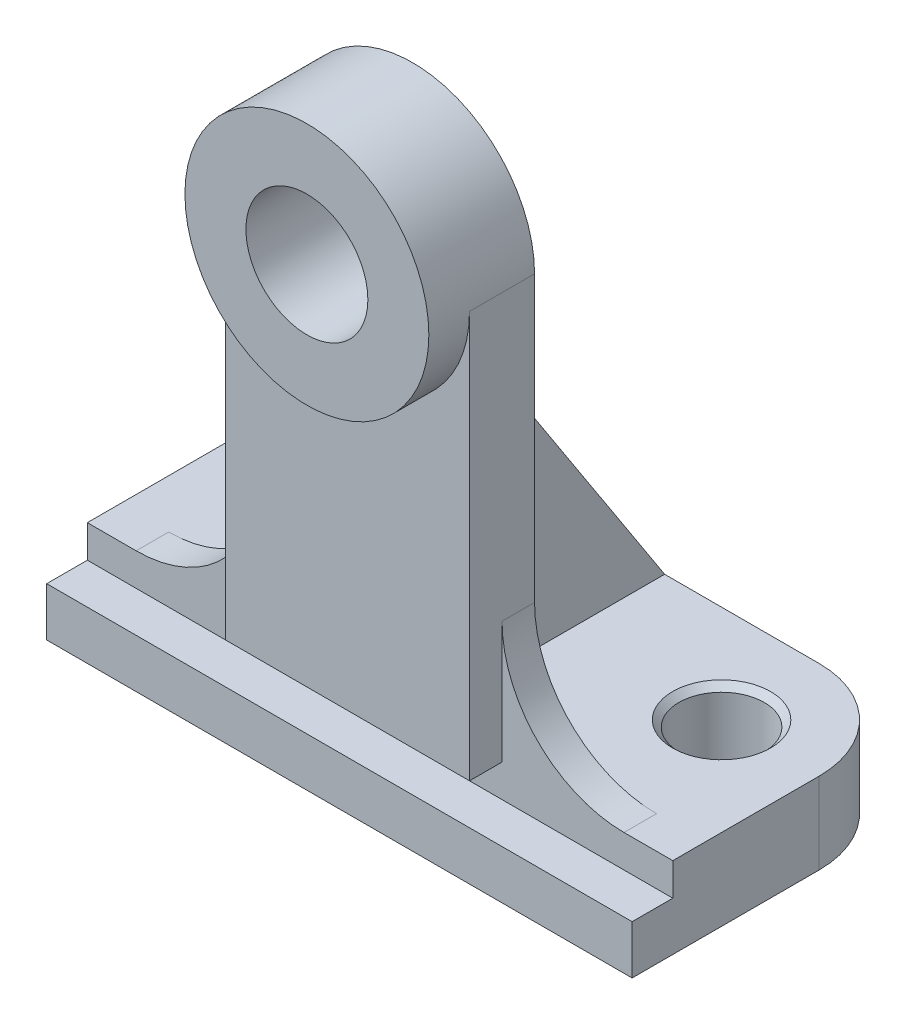
ISO-10303-21;
HEADER;
FILE_DESCRIPTION(('STEP AP214'),'2;1');
FILE_NAME('part.step','',(''),(''),'','','');
FILE_SCHEMA(('AUTOMOTIVE_DESIGN { 1 0 10303 214 1 1 1 1 }'));
ENDSEC;
DATA;
#1=APPLICATION_CONTEXT('core data for automotive mechanical design processes');
#2=APPLICATION_PROTOCOL_DEFINITION('international standard','automotive_design',2000,#1);
#3=PRODUCT_CONTEXT('',#1,'mechanical');
#4=PRODUCT('Part','Part','',(#3));
#5=PRODUCT_RELATED_PRODUCT_CATEGORY('part','',(#4));
#6=PRODUCT_DEFINITION_FORMATION('','',#4);
#7=PRODUCT_DEFINITION_CONTEXT('part definition',#1,'design');
#8=PRODUCT_DEFINITION('design','',#6,#7);
#9=PRODUCT_DEFINITION_SHAPE('','',#8);
#10=(LENGTH_UNIT() NAMED_UNIT(*) SI_UNIT(.MILLI.,.METRE.));
#11=(NAMED_UNIT(*) PLANE_ANGLE_UNIT() SI_UNIT($,.RADIAN.));
#12=(NAMED_UNIT(*) SI_UNIT($,.STERADIAN.) SOLID_ANGLE_UNIT());
#13=UNCERTAINTY_MEASURE_WITH_UNIT(LENGTH_MEASURE(1.E-05),#10,'distance_accuracy_value','');
#14=(GEOMETRIC_REPRESENTATION_CONTEXT(3) GLOBAL_UNCERTAINTY_ASSIGNED_CONTEXT((#13)) GLOBAL_UNIT_ASSIGNED_CONTEXT((#10,
#11,#12)) REPRESENTATION_CONTEXT('',''));
#15=CARTESIAN_POINT('',(0.,0.,0.));
#16=DIRECTION('',(0.,0.,1.));
#17=DIRECTION('',(1.,0.,0.));
#18=AXIS2_PLACEMENT_3D('',#15,#16,#17);
#19=CARTESIAN_POINT('',(36.,5.,0.));
#20=DIRECTION('',(0.,1.,0.));
#21=DIRECTION('',(0.,0.,1.));
#22=AXIS2_PLACEMENT_3D('',#19,#20,#21);
#23=PLANE('',#22);
#24=CARTESIAN_POINT('',(-24.,5.,-5.50000000000006));
#25=DIRECTION('',(0.,1.,0.));
#26=DIRECTION('',(0.,0.,1.));
#27=AXIS2_PLACEMENT_3D('',#24,#25,#26);
#28=CIRCLE('',#27,6.025);
#29=CARTESIAN_POINT('',(-24.,5.,0.524999999999947));
#30=VERTEX_POINT('',#29);
#31=EDGE_CURVE('E598',#30,#30,#28,.T.);
#32=ORIENTED_EDGE('',*,*,#31,.F.);
#33=EDGE_LOOP('',(#32));
#34=FACE_BOUND('',#33,.T.);
#35=DIRECTION('',(-1.,0.,0.));
#36=VECTOR('',#35,1.);
#37=CARTESIAN_POINT('',(36.,5.,-17.5000000000001));
#38=LINE('',#37,#36);
#39=CARTESIAN_POINT('',(-4.99999999999999,5.,-17.5000000000001));
#40=VERTEX_POINT('',#39);
#41=CARTESIAN_POINT('',(-24.,5.,-17.5000000000001));
#42=VERTEX_POINT('',#41);
#43=EDGE_CURVE('E288',#40,#42,#38,.T.);
#44=ORIENTED_EDGE('',*,*,#43,.T.);
#45=CARTESIAN_POINT('',(-24.,5.,-5.50000000000006));
#46=DIRECTION('',(0.,1.,0.));
#47=DIRECTION('',(0.,0.,1.));
#48=AXIS2_PLACEMENT_3D('',#45,#46,#47);
#49=CIRCLE('',#48,12.);
#50=CARTESIAN_POINT('',(-36.,5.,-5.50000000000005));
#51=VERTEX_POINT('',#50);
#52=EDGE_CURVE('E347',#42,#51,#49,.T.);
#53=ORIENTED_EDGE('',*,*,#52,.T.);
#54=DIRECTION('',(0.,0.,-1.));
#55=VECTOR('',#54,1.);
#56=CARTESIAN_POINT('',(-36.,5.,0.));
#57=LINE('',#56,#55);
#58=CARTESIAN_POINT('',(-36.,5.,12.5));
#59=VERTEX_POINT('',#58);
#60=EDGE_CURVE('E273',#59,#51,#57,.T.);
#61=ORIENTED_EDGE('',*,*,#60,.F.);
#62=DIRECTION('',(-1.,0.,0.));
#63=VECTOR('',#62,1.);
#64=CARTESIAN_POINT('',(36.,5.,12.5));
#65=LINE('',#64,#63);
#66=CARTESIAN_POINT('',(-30.,5.,12.5));
#67=VERTEX_POINT('',#66);
#68=EDGE_CURVE('E313',#67,#59,#65,.T.);
#69=ORIENTED_EDGE('',*,*,#68,.F.);
#70=DIRECTION('',(0.,0.,-1.));
#71=VECTOR('',#70,1.);
#72=CARTESIAN_POINT('',(-30.,5.,0.));
#73=LINE('',#72,#71);
#74=CARTESIAN_POINT('',(-30.,5.,8.50000000000001));
#75=VERTEX_POINT('',#74);
#76=EDGE_CURVE('E318',#67,#75,#73,.T.);
#77=ORIENTED_EDGE('',*,*,#76,.T.);
#78=DIRECTION('',(-1.,0.,0.));
#79=VECTOR('',#78,1.);
#80=CARTESIAN_POINT('',(0.,5.,8.50000000000001));
#81=LINE('',#80,#79);
#82=CARTESIAN_POINT('',(-5.,5.,8.50000000000001));
#83=VERTEX_POINT('',#82);
#84=EDGE_CURVE('E259',#83,#75,#81,.T.);
#85=ORIENTED_EDGE('',*,*,#84,.F.);
#86=DIRECTION('',(0.,0.,-1.));
#87=VECTOR('',#86,1.);
#88=CARTESIAN_POINT('',(-5.,5.,0.));
#89=LINE('',#88,#87);
#90=EDGE_CURVE('E211',#83,#40,#89,.T.);
#91=ORIENTED_EDGE('',*,*,#90,.T.);
#92=EDGE_LOOP('',(#44,#53,#61,#69,#77,#85,#91));
#93=FACE_BOUND('',#92,.T.);
#94=ADVANCED_FACE('F61',(#34,#93),#23,.T.);
#95=CARTESIAN_POINT('',(24.0000000000001,5.,-5.50000000000009));
#96=DIRECTION('',(0.,1.,0.));
#97=DIRECTION('',(0.,0.,1.));
#98=AXIS2_PLACEMENT_3D('',#95,#96,#97);
#99=CIRCLE('',#98,6.025);
#100=CARTESIAN_POINT('',(24.0000000000001,5.,0.524999999999916));
#101=VERTEX_POINT('',#100);
#102=EDGE_CURVE('E592',#101,#101,#99,.T.);
#103=ORIENTED_EDGE('',*,*,#102,.F.);
#104=EDGE_LOOP('',(#103));
#105=FACE_BOUND('',#104,.T.);
#106=DIRECTION('',(0.,0.,-1.));
#107=VECTOR('',#106,1.);
#108=CARTESIAN_POINT('',(36.,5.,0.));
#109=LINE('',#108,#107);
#110=CARTESIAN_POINT('',(36.,5.,12.5));
#111=VERTEX_POINT('',#110);
#112=CARTESIAN_POINT('',(36.,5.,-5.50000000000009));
#113=VERTEX_POINT('',#112);
#114=EDGE_CURVE('E274',#111,#113,#109,.T.);
#115=ORIENTED_EDGE('',*,*,#114,.T.);
#116=CARTESIAN_POINT('',(24.0000000000001,5.,-5.50000000000009));
#117=DIRECTION('',(0.,1.,0.));
#118=DIRECTION('',(0.,0.,1.));
#119=AXIS2_PLACEMENT_3D('',#116,#117,#118);
#120=CIRCLE('',#119,12.);
#121=CARTESIAN_POINT('',(24.,5.,-17.5000000000001));
#122=VERTEX_POINT('',#121);
#123=EDGE_CURVE('E13',#113,#122,#120,.T.);
#124=ORIENTED_EDGE('',*,*,#123,.T.);
#125=CARTESIAN_POINT('',(5.,5.,-17.5000000000001));
#126=VERTEX_POINT('',#125);
#127=EDGE_CURVE('E302',#122,#126,#38,.T.);
#128=ORIENTED_EDGE('',*,*,#127,.T.);
#129=DIRECTION('',(0.,0.,-1.));
#130=VECTOR('',#129,1.);
#131=CARTESIAN_POINT('',(5.,5.,0.));
#132=LINE('',#131,#130);
#133=CARTESIAN_POINT('',(5.,5.,8.49999999999998));
#134=VERTEX_POINT('',#133);
#135=EDGE_CURVE('E212',#134,#126,#132,.T.);
#136=ORIENTED_EDGE('',*,*,#135,.F.);
#137=CARTESIAN_POINT('',(30.0000000000001,5.,8.49999999999998));
#138=VERTEX_POINT('',#137);
#139=EDGE_CURVE('E260',#138,#134,#81,.T.);
#140=ORIENTED_EDGE('',*,*,#139,.F.);
#141=DIRECTION('',(0.,0.,-1.));
#142=VECTOR('',#141,1.);
#143=CARTESIAN_POINT('',(30.0000000000001,5.,12.5));
#144=LINE('',#143,#142);
#145=CARTESIAN_POINT('',(30.0000000000001,5.,12.5));
#146=VERTEX_POINT('',#145);
#147=EDGE_CURVE('E239',#138,#146,#144,.F.);
#148=ORIENTED_EDGE('',*,*,#147,.T.);
#149=EDGE_CURVE('E240',#111,#146,#65,.T.);
#150=ORIENTED_EDGE('',*,*,#149,.F.);
#151=EDGE_LOOP('',(#115,#124,#128,#136,#140,#148,#150));
#152=FACE_BOUND('',#151,.T.);
#153=ADVANCED_FACE('F358',(#105,#152),#23,.T.);
#154=CARTESIAN_POINT('',(36.,0.,12.5));
#155=DIRECTION('',(0.,0.,-1.));
#156=DIRECTION('',(-1.,0.,0.));
#157=AXIS2_PLACEMENT_3D('',#154,#155,#156);
#158=PLANE('',#157);
#159=CARTESIAN_POINT('',(15.,5.,12.5));
#160=VERTEX_POINT('',#159);
#161=CARTESIAN_POINT('',(-15.,5.,12.5));
#162=VERTEX_POINT('',#161);
#163=EDGE_CURVE('E316',#160,#162,#65,.T.);
#164=ORIENTED_EDGE('',*,*,#163,.T.);
#165=DIRECTION('',(0.,-1.,0.));
#166=VECTOR('',#165,1.);
#167=CARTESIAN_POINT('',(-15.,0.,12.5));
#168=LINE('',#167,#166);
#169=CARTESIAN_POINT('',(-15.,20.,12.5));
#170=VERTEX_POINT('',#169);
#171=EDGE_CURVE('E321',#170,#162,#168,.T.);
#172=ORIENTED_EDGE('',*,*,#171,.F.);
#173=CARTESIAN_POINT('',(-30.,20.,12.5));
#174=DIRECTION('',(0.,0.,-1.));
#175=DIRECTION('',(-1.,0.,0.));
#176=AXIS2_PLACEMENT_3D('',#173,#174,#175);
#177=CIRCLE('',#176,15.);
#178=EDGE_CURVE('E335',#170,#67,#177,.T.);
#179=ORIENTED_EDGE('',*,*,#178,.T.);
#180=ORIENTED_EDGE('',*,*,#68,.T.);
#181=DIRECTION('',(0.,-1.,0.));
#182=VECTOR('',#181,1.);
#183=CARTESIAN_POINT('',(-36.,0.,12.5));
#184=LINE('',#183,#182);
#185=CARTESIAN_POINT('',(-36.,1.,12.5));
#186=VERTEX_POINT('',#185);
#187=EDGE_CURVE('E291',#59,#186,#184,.T.);
#188=ORIENTED_EDGE('',*,*,#187,.T.);
#189=DIRECTION('',(-1.,0.,0.));
#190=VECTOR('',#189,1.);
#191=CARTESIAN_POINT('',(36.,1.,12.5));
#192=LINE('',#191,#190);
#193=CARTESIAN_POINT('',(36.,1.,12.5));
#194=VERTEX_POINT('',#193);
#195=EDGE_CURVE('E311',#194,#186,#192,.T.);
#196=ORIENTED_EDGE('',*,*,#195,.F.);
#197=DIRECTION('',(0.,-1.,0.));
#198=VECTOR('',#197,1.);
#199=CARTESIAN_POINT('',(36.,0.,12.5));
#200=LINE('',#199,#198);
#201=EDGE_CURVE('E277',#111,#194,#200,.T.);
#202=ORIENTED_EDGE('',*,*,#201,.F.);
#203=ORIENTED_EDGE('',*,*,#149,.T.);
#204=CARTESIAN_POINT('',(30.0000000000001,20.,12.5));
#205=DIRECTION('',(0.,0.,-1.));
#206=DIRECTION('',(-1.,0.,0.));
#207=AXIS2_PLACEMENT_3D('',#204,#205,#206);
#208=CIRCLE('',#207,15.);
#209=CARTESIAN_POINT('',(15.,20.,12.5));
#210=VERTEX_POINT('',#209);
#211=EDGE_CURVE('E340',#146,#210,#208,.T.);
#212=ORIENTED_EDGE('',*,*,#211,.T.);
#213=DIRECTION('',(0.,1.,0.));
#214=VECTOR('',#213,1.);
#215=CARTESIAN_POINT('',(15.,0.,12.5));
#216=LINE('',#215,#214);
#217=EDGE_CURVE('E327',#160,#210,#216,.T.);
#218=ORIENTED_EDGE('',*,*,#217,.F.);
#219=EDGE_LOOP('',(#164,#172,#179,#180,#188,#196,#202,#203,#212,#218));
#220=FACE_BOUND('',#219,.T.);
#221=ADVANCED_FACE('F365',(#220),#158,.F.);
#222=CARTESIAN_POINT('',(36.,1.,0.));
#223=DIRECTION('',(0.,1.,0.));
#224=DIRECTION('',(0.,0.,1.));
#225=AXIS2_PLACEMENT_3D('',#222,#223,#224);
#226=PLANE('',#225);
#227=ORIENTED_EDGE('',*,*,#195,.T.);
#228=DIRECTION('',(0.,0.,-1.));
#229=VECTOR('',#228,1.);
#230=CARTESIAN_POINT('',(-36.,1.,0.));
#231=LINE('',#230,#229);
#232=CARTESIAN_POINT('',(-36.,1.,17.5));
#233=VERTEX_POINT('',#232);
#234=EDGE_CURVE('E294',#233,#186,#231,.T.);
#235=ORIENTED_EDGE('',*,*,#234,.F.);
#236=DIRECTION('',(-1.,0.,0.));
#237=VECTOR('',#236,1.);
#238=CARTESIAN_POINT('',(36.,1.,17.5));
#239=LINE('',#238,#237);
#240=CARTESIAN_POINT('',(36.,1.,17.5));
#241=VERTEX_POINT('',#240);
#242=EDGE_CURVE('E309',#241,#233,#239,.T.);
#243=ORIENTED_EDGE('',*,*,#242,.F.);
#244=DIRECTION('',(0.,0.,-1.));
#245=VECTOR('',#244,1.);
#246=CARTESIAN_POINT('',(36.,1.,0.));
#247=LINE('',#246,#245);
#248=EDGE_CURVE('E280',#241,#194,#247,.T.);
#249=ORIENTED_EDGE('',*,*,#248,.T.);
#250=EDGE_LOOP('',(#227,#235,#243,#249));
#251=FACE_BOUND('',#250,.T.);
#252=ADVANCED_FACE('F385',(#251),#226,.T.);
#253=CARTESIAN_POINT('',(36.,0.,17.5));
#254=DIRECTION('',(0.,0.,1.));
#255=DIRECTION('',(1.,0.,0.));
#256=AXIS2_PLACEMENT_3D('',#253,#254,#255);
#257=PLANE('',#256);
#258=ORIENTED_EDGE('',*,*,#242,.T.);
#259=DIRECTION('',(0.,1.,0.));
#260=VECTOR('',#259,1.);
#261=CARTESIAN_POINT('',(-36.,0.,17.5));
#262=LINE('',#261,#260);
#263=CARTESIAN_POINT('',(-36.,-5.,17.5));
#264=VERTEX_POINT('',#263);
#265=EDGE_CURVE('E297',#264,#233,#262,.T.);
#266=ORIENTED_EDGE('',*,*,#265,.F.);
#267=DIRECTION('',(-1.,0.,0.));
#268=VECTOR('',#267,1.);
#269=CARTESIAN_POINT('',(36.,-5.,17.5));
#270=LINE('',#269,#268);
#271=CARTESIAN_POINT('',(36.,-5.,17.5));
#272=VERTEX_POINT('',#271);
#273=EDGE_CURVE('E307',#272,#264,#270,.T.);
#274=ORIENTED_EDGE('',*,*,#273,.F.);
#275=DIRECTION('',(0.,1.,0.));
#276=VECTOR('',#275,1.);
#277=CARTESIAN_POINT('',(36.,0.,17.5));
#278=LINE('',#277,#276);
#279=EDGE_CURVE('E283',#272,#241,#278,.T.);
#280=ORIENTED_EDGE('',*,*,#279,.T.);
#281=EDGE_LOOP('',(#258,#266,#274,#280));
#282=FACE_BOUND('',#281,.T.);
#283=ADVANCED_FACE('F369',(#282),#257,.T.);
#284=CARTESIAN_POINT('',(36.,-5.,0.));
#285=DIRECTION('',(0.,1.,0.));
#286=DIRECTION('',(0.,0.,1.));
#287=AXIS2_PLACEMENT_3D('',#284,#285,#286);
#288=PLANE('',#287);
#289=CARTESIAN_POINT('',(24.0000000000001,-5.,-5.50000000000009));
#290=DIRECTION('',(0.,1.,0.));
#291=DIRECTION('',(0.,0.,1.));
#292=AXIS2_PLACEMENT_3D('',#289,#290,#291);
#293=CIRCLE('',#292,5.24999999999999);
#294=CARTESIAN_POINT('',(24.0000000000001,-5.,-0.25000000000009));
#295=VERTEX_POINT('',#294);
#296=EDGE_CURVE('E594',#295,#295,#293,.T.);
#297=ORIENTED_EDGE('',*,*,#296,.T.);
#298=EDGE_LOOP('',(#297));
#299=FACE_BOUND('',#298,.T.);
#300=CARTESIAN_POINT('',(-24.,-5.,-5.50000000000006));
#301=DIRECTION('',(0.,1.,0.));
#302=DIRECTION('',(0.,0.,1.));
#303=AXIS2_PLACEMENT_3D('',#300,#301,#302);
#304=CIRCLE('',#303,5.25);
#305=CARTESIAN_POINT('',(-24.,-5.,-0.250000000000058));
#306=VERTEX_POINT('',#305);
#307=EDGE_CURVE('E218',#306,#306,#304,.T.);
#308=ORIENTED_EDGE('',*,*,#307,.T.);
#309=EDGE_LOOP('',(#308));
#310=FACE_BOUND('',#309,.T.);
#311=DIRECTION('',(0.,0.,-1.));
#312=VECTOR('',#311,1.);
#313=CARTESIAN_POINT('',(-36.,-5.,0.));
#314=LINE('',#313,#312);
#315=CARTESIAN_POINT('',(-36.,-5.,-5.50000000000005));
#316=VERTEX_POINT('',#315);
#317=EDGE_CURVE('E278',#264,#316,#314,.T.);
#318=ORIENTED_EDGE('',*,*,#317,.T.);
#319=CARTESIAN_POINT('',(-24.,-5.,-5.50000000000006));
#320=DIRECTION('',(0.,1.,0.));
#321=DIRECTION('',(0.,0.,1.));
#322=AXIS2_PLACEMENT_3D('',#319,#320,#321);
#323=CIRCLE('',#322,12.);
#324=CARTESIAN_POINT('',(-24.,-5.,-17.5000000000001));
#325=VERTEX_POINT('',#324);
#326=EDGE_CURVE('E352',#316,#325,#323,.F.);
#327=ORIENTED_EDGE('',*,*,#326,.T.);
#328=DIRECTION('',(-1.,0.,0.));
#329=VECTOR('',#328,1.);
#330=CARTESIAN_POINT('',(36.,-5.,-17.5000000000001));
#331=LINE('',#330,#329);
#332=CARTESIAN_POINT('',(24.,-5.,-17.5000000000001));
#333=VERTEX_POINT('',#332);
#334=EDGE_CURVE('E304',#333,#325,#331,.T.);
#335=ORIENTED_EDGE('',*,*,#334,.F.);
#336=CARTESIAN_POINT('',(24.0000000000001,-5.,-5.50000000000009));
#337=DIRECTION('',(0.,1.,0.));
#338=DIRECTION('',(0.,0.,1.));
#339=AXIS2_PLACEMENT_3D('',#336,#337,#338);
#340=CIRCLE('',#339,12.);
#341=CARTESIAN_POINT('',(36.,-5.,-5.50000000000009));
#342=VERTEX_POINT('',#341);
#343=EDGE_CURVE('E82',#333,#342,#340,.F.);
#344=ORIENTED_EDGE('',*,*,#343,.T.);
#345=DIRECTION('',(0.,0.,-1.));
#346=VECTOR('',#345,1.);
#347=CARTESIAN_POINT('',(36.,-5.,0.));
#348=LINE('',#347,#346);
#349=EDGE_CURVE('E286',#272,#342,#348,.T.);
#350=ORIENTED_EDGE('',*,*,#349,.F.);
#351=ORIENTED_EDGE('',*,*,#273,.T.);
#352=EDGE_LOOP('',(#318,#327,#335,#344,#350,#351));
#353=FACE_BOUND('',#352,.T.);
#354=ADVANCED_FACE('F373',(#299,#310,#353),#288,.F.);
#355=CARTESIAN_POINT('',(36.,0.,-17.5000000000001));
#356=DIRECTION('',(0.,0.,1.));
#357=DIRECTION('',(1.,0.,0.));
#358=AXIS2_PLACEMENT_3D('',#355,#356,#357);
#359=PLANE('',#358);
#360=ORIENTED_EDGE('',*,*,#334,.T.);
#361=DIRECTION('',(0.,1.,0.));
#362=VECTOR('',#361,1.);
#363=CARTESIAN_POINT('',(-24.,0.,-17.5000000000001));
#364=LINE('',#363,#362);
#365=EDGE_CURVE('E344',#325,#42,#364,.T.);
#366=ORIENTED_EDGE('',*,*,#365,.T.);
#367=ORIENTED_EDGE('',*,*,#43,.F.);
#368=DIRECTION('',(-1.,0.,0.));
#369=VECTOR('',#368,1.);
#370=CARTESIAN_POINT('',(36.,5.,-17.5000000000001));
#371=LINE('',#370,#369);
#372=EDGE_CURVE('E204',#126,#40,#371,.T.);
#373=ORIENTED_EDGE('',*,*,#372,.F.);
#374=ORIENTED_EDGE('',*,*,#127,.F.);
#375=DIRECTION('',(0.,1.,0.));
#376=VECTOR('',#375,1.);
#377=CARTESIAN_POINT('',(24.,-5.,-17.5000000000001));
#378=LINE('',#377,#376);
#379=EDGE_CURVE('E342',#122,#333,#378,.F.);
#380=ORIENTED_EDGE('',*,*,#379,.T.);
#381=EDGE_LOOP('',(#360,#366,#367,#373,#374,#380));
#382=FACE_BOUND('',#381,.T.);
#383=ADVANCED_FACE('F376',(#382),#359,.F.);
#384=CARTESIAN_POINT('',(36.,0.,0.));
#385=DIRECTION('',(1.,0.,0.));
#386=DIRECTION('',(0.,0.,-1.));
#387=AXIS2_PLACEMENT_3D('',#384,#385,#386);
#388=PLANE('',#387);
#389=ORIENTED_EDGE('',*,*,#349,.T.);
#390=DIRECTION('',(0.,1.,0.));
#391=VECTOR('',#390,1.);
#392=CARTESIAN_POINT('',(36.,5.,-5.50000000000009));
#393=LINE('',#392,#391);
#394=EDGE_CURVE('E69',#342,#113,#393,.T.);
#395=ORIENTED_EDGE('',*,*,#394,.T.);
#396=ORIENTED_EDGE('',*,*,#114,.F.);
#397=ORIENTED_EDGE('',*,*,#201,.T.);
#398=ORIENTED_EDGE('',*,*,#248,.F.);
#399=ORIENTED_EDGE('',*,*,#279,.F.);
#400=EDGE_LOOP('',(#389,#395,#396,#397,#398,#399));
#401=FACE_BOUND('',#400,.T.);
#402=ADVANCED_FACE('F355',(#401),#388,.T.);
#403=CARTESIAN_POINT('',(-36.,0.,0.));
#404=DIRECTION('',(1.,0.,0.));
#405=DIRECTION('',(0.,0.,-1.));
#406=AXIS2_PLACEMENT_3D('',#403,#404,#405);
#407=PLANE('',#406);
#408=ORIENTED_EDGE('',*,*,#60,.T.);
#409=DIRECTION('',(0.,1.,0.));
#410=VECTOR('',#409,1.);
#411=CARTESIAN_POINT('',(-36.,0.,-5.50000000000005));
#412=LINE('',#411,#410);
#413=EDGE_CURVE('E349',#51,#316,#412,.F.);
#414=ORIENTED_EDGE('',*,*,#413,.T.);
#415=ORIENTED_EDGE('',*,*,#317,.F.);
#416=ORIENTED_EDGE('',*,*,#265,.T.);
#417=ORIENTED_EDGE('',*,*,#234,.T.);
#418=ORIENTED_EDGE('',*,*,#187,.F.);
#419=EDGE_LOOP('',(#408,#414,#415,#416,#417,#418));
#420=FACE_BOUND('',#419,.T.);
#421=ADVANCED_FACE('F452',(#420),#407,.F.);
#422=CARTESIAN_POINT('',(0.,5.,16.5));
#423=DIRECTION('',(0.,-1.,0.));
#424=DIRECTION('',(0.,0.,-1.));
#425=AXIS2_PLACEMENT_3D('',#422,#423,#424);
#426=PLANE('',#425);
#427=DIRECTION('',(-1.,0.,0.));
#428=VECTOR('',#427,1.);
#429=CARTESIAN_POINT('',(0.,5.,16.5));
#430=LINE('',#429,#428);
#431=CARTESIAN_POINT('',(15.0000000000001,5.,16.5));
#432=VERTEX_POINT('',#431);
#433=CARTESIAN_POINT('',(-15.,5.,16.4999999999999));
#434=VERTEX_POINT('',#433);
#435=EDGE_CURVE('E244',#432,#434,#430,.T.);
#436=ORIENTED_EDGE('',*,*,#435,.T.);
#437=DIRECTION('',(0.,0.,-1.));
#438=VECTOR('',#437,1.);
#439=CARTESIAN_POINT('',(-15.,5.,16.4999999999999));
#440=LINE('',#439,#438);
#441=EDGE_CURVE('E268',#434,#162,#440,.T.);
#442=ORIENTED_EDGE('',*,*,#441,.T.);
#443=ORIENTED_EDGE('',*,*,#163,.F.);
#444=DIRECTION('',(0.,0.,-1.));
#445=VECTOR('',#444,1.);
#446=CARTESIAN_POINT('',(15.0000000000001,5.,16.5));
#447=LINE('',#446,#445);
#448=EDGE_CURVE('E265',#432,#160,#447,.T.);
#449=ORIENTED_EDGE('',*,*,#448,.F.);
#450=EDGE_LOOP('',(#436,#442,#443,#449));
#451=FACE_BOUND('',#450,.T.);
#452=ADVANCED_FACE('F448',(#451),#426,.T.);
#453=CARTESIAN_POINT('',(0.,55.,16.5));
#454=DIRECTION('',(0.,0.,-1.));
#455=DIRECTION('',(-1.,0.,0.));
#456=AXIS2_PLACEMENT_3D('',#453,#454,#455);
#457=CYLINDRICAL_SURFACE('',#456,15.);
#458=CARTESIAN_POINT('',(0.,55.,21.5));
#459=DIRECTION('',(0.,0.,1.));
#460=DIRECTION('',(1.,0.,0.));
#461=AXIS2_PLACEMENT_3D('',#458,#459,#460);
#462=CIRCLE('',#461,15.);
#463=CARTESIAN_POINT('',(15.,55.,21.5));
#464=VERTEX_POINT('',#463);
#465=EDGE_CURVE('E233',#464,#464,#462,.T.);
#466=ORIENTED_EDGE('',*,*,#465,.F.);
#467=EDGE_LOOP('',(#466));
#468=FACE_BOUND('',#467,.T.);
#469=CARTESIAN_POINT('',(0.,55.,16.5));
#470=DIRECTION('',(0.,0.,1.));
#471=DIRECTION('',(1.,0.,0.));
#472=AXIS2_PLACEMENT_3D('',#469,#470,#471);
#473=CIRCLE('',#472,15.);
#474=CARTESIAN_POINT('',(-15.,55.,16.4999999999999));
#475=VERTEX_POINT('',#474);
#476=CARTESIAN_POINT('',(15.0000000000001,55.,16.5));
#477=VERTEX_POINT('',#476);
#478=EDGE_CURVE('E237',#475,#477,#473,.T.);
#479=ORIENTED_EDGE('',*,*,#478,.T.);
#480=DIRECTION('',(0.,0.,-1.));
#481=VECTOR('',#480,1.);
#482=CARTESIAN_POINT('',(15.0000000000001,55.,16.5));
#483=LINE('',#482,#481);
#484=CARTESIAN_POINT('',(15.,55.,8.49999999999998));
#485=VERTEX_POINT('',#484);
#486=EDGE_CURVE('E250',#477,#485,#483,.T.);
#487=ORIENTED_EDGE('',*,*,#486,.T.);
#488=CARTESIAN_POINT('',(0.,55.,8.50000000000001));
#489=DIRECTION('',(0.,0.,1.));
#490=DIRECTION('',(1.,0.,0.));
#491=AXIS2_PLACEMENT_3D('',#488,#489,#490);
#492=CIRCLE('',#491,15.);
#493=CARTESIAN_POINT('',(-15.,55.,8.50000000000001));
#494=VERTEX_POINT('',#493);
#495=EDGE_CURVE('E253',#494,#485,#492,.F.);
#496=ORIENTED_EDGE('',*,*,#495,.F.);
#497=DIRECTION('',(0.,0.,-1.));
#498=VECTOR('',#497,1.);
#499=CARTESIAN_POINT('',(-15.,55.,16.4999999999999));
#500=LINE('',#499,#498);
#501=EDGE_CURVE('E271',#475,#494,#500,.T.);
#502=ORIENTED_EDGE('',*,*,#501,.F.);
#503=EDGE_LOOP('',(#479,#487,#496,#502));
#504=FACE_BOUND('',#503,.T.);
#505=ADVANCED_FACE('F451',(#468,#504),#457,.T.);
#506=CARTESIAN_POINT('',(-15.,0.,16.4999999999999));
#507=DIRECTION('',(1.,0.,0.));
#508=DIRECTION('',(0.,1.,0.));
#509=AXIS2_PLACEMENT_3D('',#506,#507,#508);
#510=PLANE('',#509);
#511=DIRECTION('',(0.,-1.,0.));
#512=VECTOR('',#511,1.);
#513=CARTESIAN_POINT('',(-15.,0.,8.50000000000001));
#514=LINE('',#513,#512);
#515=CARTESIAN_POINT('',(-15.,20.,8.50000000000001));
#516=VERTEX_POINT('',#515);
#517=EDGE_CURVE('E256',#494,#516,#514,.T.);
#518=ORIENTED_EDGE('',*,*,#517,.T.);
#519=DIRECTION('',(0.,0.,-1.));
#520=VECTOR('',#519,1.);
#521=CARTESIAN_POINT('',(-15.,20.,16.4999999999999));
#522=LINE('',#521,#520);
#523=EDGE_CURVE('E324',#516,#170,#522,.F.);
#524=ORIENTED_EDGE('',*,*,#523,.T.);
#525=ORIENTED_EDGE('',*,*,#171,.T.);
#526=ORIENTED_EDGE('',*,*,#441,.F.);
#527=DIRECTION('',(0.,-1.,0.));
#528=VECTOR('',#527,1.);
#529=CARTESIAN_POINT('',(-15.,0.,16.4999999999999));
#530=LINE('',#529,#528);
#531=EDGE_CURVE('E241',#475,#434,#530,.T.);
#532=ORIENTED_EDGE('',*,*,#531,.F.);
#533=ORIENTED_EDGE('',*,*,#501,.T.);
#534=EDGE_LOOP('',(#518,#524,#525,#526,#532,#533));
#535=FACE_BOUND('',#534,.T.);
#536=ADVANCED_FACE('F454',(#535),#510,.F.);
#537=CARTESIAN_POINT('',(0.,55.,16.5));
#538=DIRECTION('',(0.,0.,-1.));
#539=DIRECTION('',(-1.,0.,0.));
#540=AXIS2_PLACEMENT_3D('',#537,#538,#539);
#541=CYLINDRICAL_SURFACE('',#540,7.5);
#542=CARTESIAN_POINT('',(0.,55.,21.5));
#543=DIRECTION('',(0.,0.,1.));
#544=DIRECTION('',(1.,0.,0.));
#545=AXIS2_PLACEMENT_3D('',#542,#543,#544);
#546=CIRCLE('',#545,7.5);
#547=CARTESIAN_POINT('',(7.50000000000003,55.,21.5));
#548=VERTEX_POINT('',#547);
#549=EDGE_CURVE('E230',#548,#548,#546,.T.);
#550=ORIENTED_EDGE('',*,*,#549,.T.);
#551=EDGE_LOOP('',(#550));
#552=FACE_BOUND('',#551,.T.);
#553=CARTESIAN_POINT('',(0.,55.,8.50000000000001));
#554=DIRECTION('',(0.,0.,1.));
#555=DIRECTION('',(1.,0.,0.));
#556=AXIS2_PLACEMENT_3D('',#553,#554,#555);
#557=CIRCLE('',#556,7.5);
#558=CARTESIAN_POINT('',(7.50000000000001,55.,8.50000000000001));
#559=VERTEX_POINT('',#558);
#560=EDGE_CURVE('E236',#559,#559,#557,.T.);
#561=ORIENTED_EDGE('',*,*,#560,.F.);
#562=EDGE_LOOP('',(#561));
#563=FACE_BOUND('',#562,.T.);
#564=ADVANCED_FACE('F446',(#552,#563),#541,.F.);
#565=CARTESIAN_POINT('',(15.0000000000001,0.,16.5));
#566=DIRECTION('',(1.,0.,0.));
#567=DIRECTION('',(0.,1.,0.));
#568=AXIS2_PLACEMENT_3D('',#565,#566,#567);
#569=PLANE('',#568);
#570=ORIENTED_EDGE('',*,*,#217,.T.);
#571=DIRECTION('',(0.,0.,-1.));
#572=VECTOR('',#571,1.);
#573=CARTESIAN_POINT('',(15.,20.,8.49999999999998));
#574=LINE('',#573,#572);
#575=CARTESIAN_POINT('',(15.,20.,8.49999999999998));
#576=VERTEX_POINT('',#575);
#577=EDGE_CURVE('E330',#210,#576,#574,.T.);
#578=ORIENTED_EDGE('',*,*,#577,.T.);
#579=DIRECTION('',(0.,-1.,0.));
#580=VECTOR('',#579,1.);
#581=CARTESIAN_POINT('',(15.,0.,8.49999999999998));
#582=LINE('',#581,#580);
#583=EDGE_CURVE('E245',#485,#576,#582,.T.);
#584=ORIENTED_EDGE('',*,*,#583,.F.);
#585=ORIENTED_EDGE('',*,*,#486,.F.);
#586=DIRECTION('',(0.,-1.,0.));
#587=VECTOR('',#586,1.);
#588=CARTESIAN_POINT('',(15.0000000000001,0.,16.5));
#589=LINE('',#588,#587);
#590=EDGE_CURVE('E247',#477,#432,#589,.T.);
#591=ORIENTED_EDGE('',*,*,#590,.T.);
#592=ORIENTED_EDGE('',*,*,#448,.T.);
#593=EDGE_LOOP('',(#570,#578,#584,#585,#591,#592));
#594=FACE_BOUND('',#593,.T.);
#595=ADVANCED_FACE('F439',(#594),#569,.T.);
#596=CARTESIAN_POINT('',(0.,0.,16.5));
#597=DIRECTION('',(0.,0.,1.));
#598=DIRECTION('',(1.,0.,0.));
#599=AXIS2_PLACEMENT_3D('',#596,#597,#598);
#600=PLANE('',#599);
#601=ORIENTED_EDGE('',*,*,#590,.F.);
#602=ORIENTED_EDGE('',*,*,#478,.F.);
#603=ORIENTED_EDGE('',*,*,#531,.T.);
#604=ORIENTED_EDGE('',*,*,#435,.F.);
#605=EDGE_LOOP('',(#601,#602,#603,#604));
#606=FACE_BOUND('',#605,.T.);
#607=ADVANCED_FACE('F436',(#606),#600,.T.);
#608=CARTESIAN_POINT('',(0.,0.,8.50000000000001));
#609=DIRECTION('',(0.,0.,1.));
#610=DIRECTION('',(1.,0.,0.));
#611=AXIS2_PLACEMENT_3D('',#608,#609,#610);
#612=PLANE('',#611);
#613=ORIENTED_EDGE('',*,*,#560,.T.);
#614=EDGE_LOOP('',(#613));
#615=FACE_BOUND('',#614,.T.);
#616=ORIENTED_EDGE('',*,*,#139,.T.);
#617=DIRECTION('',(0.,1.,0.));
#618=VECTOR('',#617,1.);
#619=CARTESIAN_POINT('',(5.,0.,8.49999999999998));
#620=LINE('',#619,#618);
#621=CARTESIAN_POINT('',(5.,45.,8.49999999999998));
#622=VERTEX_POINT('',#621);
#623=EDGE_CURVE('E199',#134,#622,#620,.T.);
#624=ORIENTED_EDGE('',*,*,#623,.T.);
#625=DIRECTION('',(-1.,0.,0.));
#626=VECTOR('',#625,1.);
#627=CARTESIAN_POINT('',(0.,45.,8.50000000000001));
#628=LINE('',#627,#626);
#629=CARTESIAN_POINT('',(-5.,45.,8.50000000000001));
#630=VERTEX_POINT('',#629);
#631=EDGE_CURVE('E192',#622,#630,#628,.T.);
#632=ORIENTED_EDGE('',*,*,#631,.T.);
#633=DIRECTION('',(0.,1.,0.));
#634=VECTOR('',#633,1.);
#635=CARTESIAN_POINT('',(-5.,0.,8.50000000000001));
#636=LINE('',#635,#634);
#637=EDGE_CURVE('E196',#83,#630,#636,.T.);
#638=ORIENTED_EDGE('',*,*,#637,.F.);
#639=ORIENTED_EDGE('',*,*,#84,.T.);
#640=CARTESIAN_POINT('',(-30.,20.,8.50000000000001));
#641=DIRECTION('',(0.,0.,1.));
#642=DIRECTION('',(1.,0.,0.));
#643=AXIS2_PLACEMENT_3D('',#640,#641,#642);
#644=CIRCLE('',#643,15.);
#645=EDGE_CURVE('E333',#75,#516,#644,.T.);
#646=ORIENTED_EDGE('',*,*,#645,.T.);
#647=ORIENTED_EDGE('',*,*,#517,.F.);
#648=ORIENTED_EDGE('',*,*,#495,.T.);
#649=ORIENTED_EDGE('',*,*,#583,.T.);
#650=CARTESIAN_POINT('',(30.0000000000001,20.,8.49999999999998));
#651=DIRECTION('',(0.,0.,1.));
#652=DIRECTION('',(1.,0.,0.));
#653=AXIS2_PLACEMENT_3D('',#650,#651,#652);
#654=CIRCLE('',#653,15.);
#655=EDGE_CURVE('E337',#576,#138,#654,.T.);
#656=ORIENTED_EDGE('',*,*,#655,.T.);
#657=EDGE_LOOP('',(#616,#624,#632,#638,#639,#646,#647,#648,#649,#656));
#658=FACE_BOUND('',#657,.T.);
#659=ADVANCED_FACE('F195',(#615,#658),#612,.F.);
#660=CARTESIAN_POINT('',(0.,55.,21.5));
#661=DIRECTION('',(0.,0.,1.));
#662=DIRECTION('',(1.,0.,0.));
#663=AXIS2_PLACEMENT_3D('',#660,#661,#662);
#664=PLANE('',#663);
#665=ORIENTED_EDGE('',*,*,#549,.F.);
#666=EDGE_LOOP('',(#665));
#667=FACE_BOUND('',#666,.T.);
#668=ORIENTED_EDGE('',*,*,#465,.T.);
#669=EDGE_LOOP('',(#668));
#670=FACE_BOUND('',#669,.T.);
#671=ADVANCED_FACE('F405',(#667,#670),#664,.T.);
#672=CARTESIAN_POINT('',(-30.,20.,0.));
#673=DIRECTION('',(0.,0.,-1.));
#674=DIRECTION('',(-1.,0.,0.));
#675=AXIS2_PLACEMENT_3D('',#672,#673,#674);
#676=CYLINDRICAL_SURFACE('',#675,15.);
#677=ORIENTED_EDGE('',*,*,#178,.F.);
#678=ORIENTED_EDGE('',*,*,#523,.F.);
#679=ORIENTED_EDGE('',*,*,#645,.F.);
#680=ORIENTED_EDGE('',*,*,#76,.F.);
#681=EDGE_LOOP('',(#677,#678,#679,#680));
#682=FACE_BOUND('',#681,.T.);
#683=ADVANCED_FACE('F401',(#682),#676,.F.);
#684=CARTESIAN_POINT('',(30.,20.,16.5));
#685=DIRECTION('',(0.,0.,1.));
#686=DIRECTION('',(1.,0.,0.));
#687=AXIS2_PLACEMENT_3D('',#684,#685,#686);
#688=CYLINDRICAL_SURFACE('',#687,15.);
#689=ORIENTED_EDGE('',*,*,#211,.F.);
#690=ORIENTED_EDGE('',*,*,#147,.F.);
#691=ORIENTED_EDGE('',*,*,#655,.F.);
#692=ORIENTED_EDGE('',*,*,#577,.F.);
#693=EDGE_LOOP('',(#689,#690,#691,#692));
#694=FACE_BOUND('',#693,.T.);
#695=ADVANCED_FACE('F404',(#694),#688,.F.);
#696=CARTESIAN_POINT('',(0.,5.,-17.5000000000001));
#697=DIRECTION('',(0.,0.544988350595414,-0.838443616300638));
#698=DIRECTION('',(0.,0.838443616300637,0.544988350595415));
#699=AXIS2_PLACEMENT_3D('',#696,#697,#698);
#700=PLANE('',#699);
#701=DIRECTION('',(0.,0.838443616300637,0.544988350595415));
#702=VECTOR('',#701,1.);
#703=CARTESIAN_POINT('',(5.,5.,-17.5000000000001));
#704=LINE('',#703,#702);
#705=EDGE_CURVE('E217',#126,#622,#704,.T.);
#706=ORIENTED_EDGE('',*,*,#705,.F.);
#707=ORIENTED_EDGE('',*,*,#372,.T.);
#708=DIRECTION('',(0.,0.838443616300637,0.544988350595415));
#709=VECTOR('',#708,1.);
#710=CARTESIAN_POINT('',(-5.,5.,-17.5000000000001));
#711=LINE('',#710,#709);
#712=EDGE_CURVE('E210',#40,#630,#711,.T.);
#713=ORIENTED_EDGE('',*,*,#712,.T.);
#714=ORIENTED_EDGE('',*,*,#631,.F.);
#715=EDGE_LOOP('',(#706,#707,#713,#714));
#716=FACE_BOUND('',#715,.T.);
#717=ADVANCED_FACE('F215',(#716),#700,.T.);
#718=CARTESIAN_POINT('',(5.,32.5,1.99999999999997));
#719=DIRECTION('',(1.,0.,0.));
#720=DIRECTION('',(0.,0.,-1.));
#721=AXIS2_PLACEMENT_3D('',#718,#719,#720);
#722=PLANE('',#721);
#723=ORIENTED_EDGE('',*,*,#623,.F.);
#724=ORIENTED_EDGE('',*,*,#135,.T.);
#725=ORIENTED_EDGE('',*,*,#705,.T.);
#726=EDGE_LOOP('',(#723,#724,#725));
#727=FACE_BOUND('',#726,.T.);
#728=ADVANCED_FACE('F417',(#727),#722,.T.);
#729=CARTESIAN_POINT('',(-5.,32.5,2.));
#730=DIRECTION('',(1.,0.,0.));
#731=DIRECTION('',(0.,0.,-1.));
#732=AXIS2_PLACEMENT_3D('',#729,#730,#731);
#733=PLANE('',#732);
#734=ORIENTED_EDGE('',*,*,#90,.F.);
#735=ORIENTED_EDGE('',*,*,#637,.T.);
#736=ORIENTED_EDGE('',*,*,#712,.F.);
#737=EDGE_LOOP('',(#734,#735,#736));
#738=FACE_BOUND('',#737,.T.);
#739=ADVANCED_FACE('F209',(#738),#733,.F.);
#740=CARTESIAN_POINT('',(-24.,0.,-5.50000000000006));
#741=DIRECTION('',(0.,1.,0.));
#742=DIRECTION('',(0.,0.,1.));
#743=AXIS2_PLACEMENT_3D('',#740,#741,#742);
#744=CYLINDRICAL_SURFACE('',#743,12.);
#745=ORIENTED_EDGE('',*,*,#326,.F.);
#746=ORIENTED_EDGE('',*,*,#413,.F.);
#747=ORIENTED_EDGE('',*,*,#52,.F.);
#748=ORIENTED_EDGE('',*,*,#365,.F.);
#749=EDGE_LOOP('',(#745,#746,#747,#748));
#750=FACE_BOUND('',#749,.T.);
#751=ADVANCED_FACE('F409',(#750),#744,.T.);
#752=CARTESIAN_POINT('',(24.0000000000001,0.,-5.50000000000009));
#753=DIRECTION('',(0.,-1.,0.));
#754=DIRECTION('',(0.,0.,-1.));
#755=AXIS2_PLACEMENT_3D('',#752,#753,#754);
#756=CYLINDRICAL_SURFACE('',#755,12.);
#757=ORIENTED_EDGE('',*,*,#343,.F.);
#758=ORIENTED_EDGE('',*,*,#379,.F.);
#759=ORIENTED_EDGE('',*,*,#123,.F.);
#760=ORIENTED_EDGE('',*,*,#394,.F.);
#761=EDGE_LOOP('',(#757,#758,#759,#760));
#762=FACE_BOUND('',#761,.T.);
#763=ADVANCED_FACE('F63',(#762),#756,.T.);
#764=CARTESIAN_POINT('',(-24.,5.,-5.50000000000006));
#765=DIRECTION('',(0.,1.,0.));
#766=DIRECTION('',(0.,0.,1.));
#767=AXIS2_PLACEMENT_3D('',#764,#765,#766);
#768=CYLINDRICAL_SURFACE('',#767,5.24999999999999);
#769=ORIENTED_EDGE('',*,*,#307,.F.);
#770=EDGE_LOOP('',(#769));
#771=FACE_BOUND('',#770,.T.);
#772=CARTESIAN_POINT('',(-24.,4.22499999999999,-5.50000000000006));
#773=DIRECTION('',(0.,1.,0.));
#774=DIRECTION('',(0.,0.,1.));
#775=AXIS2_PLACEMENT_3D('',#772,#773,#774);
#776=CIRCLE('',#775,5.24999999999999);
#777=CARTESIAN_POINT('',(-24.,4.22499999999999,-0.250000000000069));
#778=VERTEX_POINT('',#777);
#779=EDGE_CURVE('E222',#778,#778,#776,.T.);
#780=ORIENTED_EDGE('',*,*,#779,.T.);
#781=EDGE_LOOP('',(#780));
#782=FACE_BOUND('',#781,.T.);
#783=ADVANCED_FACE('F416',(#771,#782),#768,.F.);
#784=CARTESIAN_POINT('',(-24.,5.,-5.50000000000006));
#785=DIRECTION('',(0.,1.,0.));
#786=DIRECTION('',(0.,0.,1.));
#787=AXIS2_PLACEMENT_3D('',#784,#785,#786);
#788=CONICAL_SURFACE('',#787,6.025,0.78539816339745);
#789=ORIENTED_EDGE('',*,*,#779,.F.);
#790=EDGE_LOOP('',(#789));
#791=FACE_BOUND('',#790,.T.);
#792=ORIENTED_EDGE('',*,*,#31,.T.);
#793=EDGE_LOOP('',(#792));
#794=FACE_BOUND('',#793,.T.);
#795=ADVANCED_FACE('F542',(#791,#794),#788,.F.);
#796=CARTESIAN_POINT('',(24.0000000000001,5.,-5.50000000000009));
#797=DIRECTION('',(0.,1.,0.));
#798=DIRECTION('',(0.,0.,1.));
#799=AXIS2_PLACEMENT_3D('',#796,#797,#798);
#800=CYLINDRICAL_SURFACE('',#799,5.24999999999999);
#801=ORIENTED_EDGE('',*,*,#296,.F.);
#802=EDGE_LOOP('',(#801));
#803=FACE_BOUND('',#802,.T.);
#804=CARTESIAN_POINT('',(24.0000000000001,4.22499999999999,-5.50000000000009));
#805=DIRECTION('',(0.,1.,0.));
#806=DIRECTION('',(0.,0.,1.));
#807=AXIS2_PLACEMENT_3D('',#804,#805,#806);
#808=CIRCLE('',#807,5.24999999999999);
#809=CARTESIAN_POINT('',(24.0000000000001,4.22499999999999,-0.250000000000096));
#810=VERTEX_POINT('',#809);
#811=EDGE_CURVE('E589',#810,#810,#808,.T.);
#812=ORIENTED_EDGE('',*,*,#811,.T.);
#813=EDGE_LOOP('',(#812));
#814=FACE_BOUND('',#813,.T.);
#815=ADVANCED_FACE('F552',(#803,#814),#800,.F.);
#816=CARTESIAN_POINT('',(24.0000000000001,5.,-5.50000000000009));
#817=DIRECTION('',(0.,1.,0.));
#818=DIRECTION('',(0.,0.,1.));
#819=AXIS2_PLACEMENT_3D('',#816,#817,#818);
#820=CONICAL_SURFACE('',#819,6.025,0.785398163397448);
#821=ORIENTED_EDGE('',*,*,#811,.F.);
#822=EDGE_LOOP('',(#821));
#823=FACE_BOUND('',#822,.T.);
#824=ORIENTED_EDGE('',*,*,#102,.T.);
#825=EDGE_LOOP('',(#824));
#826=FACE_BOUND('',#825,.T.);
#827=ADVANCED_FACE('F561',(#823,#826),#820,.F.);
#828=CLOSED_SHELL('',(#94,#153,#221,#252,#283,#354,#383,#402,#421,#452,#505,#536,#564,#595,#607,
#659,#671,#683,#695,#717,#728,#739,#751,#763,#783,#795,#815,#827));
#829=MANIFOLD_SOLID_BREP('B2',#828);
#830=ADVANCED_BREP_SHAPE_REPRESENTATION('',(#18,#829),#14);
#831=SHAPE_DEFINITION_REPRESENTATION(#9,#830);
ENDSEC;
END-ISO-10303-21;
